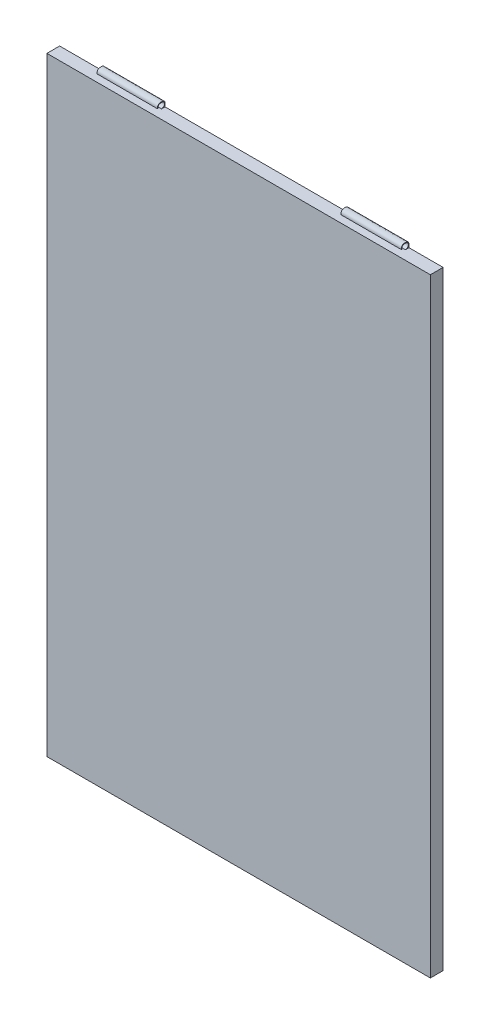
ISO-10303-21;
HEADER;
FILE_DESCRIPTION(('STEP AP214'),'2;1');
FILE_NAME('part.step','',(''),(''),'','','');
FILE_SCHEMA(('AUTOMOTIVE_DESIGN { 1 0 10303 214 1 1 1 1 }'));
ENDSEC;
DATA;
#1=APPLICATION_CONTEXT('core data for automotive mechanical design processes');
#2=APPLICATION_PROTOCOL_DEFINITION('international standard','automotive_design',2000,#1);
#3=PRODUCT_CONTEXT('',#1,'mechanical');
#4=PRODUCT('Part','Part','',(#3));
#5=PRODUCT_RELATED_PRODUCT_CATEGORY('part','',(#4));
#6=PRODUCT_DEFINITION_FORMATION('','',#4);
#7=PRODUCT_DEFINITION_CONTEXT('part definition',#1,'design');
#8=PRODUCT_DEFINITION('design','',#6,#7);
#9=PRODUCT_DEFINITION_SHAPE('','',#8);
#10=(LENGTH_UNIT() NAMED_UNIT(*) SI_UNIT(.MILLI.,.METRE.));
#11=(NAMED_UNIT(*) PLANE_ANGLE_UNIT() SI_UNIT($,.RADIAN.));
#12=(NAMED_UNIT(*) SI_UNIT($,.STERADIAN.) SOLID_ANGLE_UNIT());
#13=UNCERTAINTY_MEASURE_WITH_UNIT(LENGTH_MEASURE(1.E-05),#10,'distance_accuracy_value','');
#14=(GEOMETRIC_REPRESENTATION_CONTEXT(3) GLOBAL_UNCERTAINTY_ASSIGNED_CONTEXT((#13)) GLOBAL_UNIT_ASSIGNED_CONTEXT((#10,
#11,#12)) REPRESENTATION_CONTEXT('',''));
#15=CARTESIAN_POINT('',(0.,0.,0.));
#16=DIRECTION('',(0.,0.,1.));
#17=DIRECTION('',(1.,0.,0.));
#18=AXIS2_PLACEMENT_3D('',#15,#16,#17);
#19=CARTESIAN_POINT('',(0.,0.,-20.));
#20=DIRECTION('',(0.,0.,-1.));
#21=DIRECTION('',(-1.,0.,0.));
#22=AXIS2_PLACEMENT_3D('',#19,#20,#21);
#23=PLANE('',#22);
#24=DIRECTION('',(-1.,0.,0.));
#25=VECTOR('',#24,1.);
#26=CARTESIAN_POINT('',(0.,68.869953124109,-20.));
#27=LINE('',#26,#25);
#28=CARTESIAN_POINT('',(33.1920008977773,68.869953124109,-20.));
#29=VERTEX_POINT('',#28);
#30=CARTESIAN_POINT('',(-32.3754625293435,68.869953124109,-20.));
#31=VERTEX_POINT('',#30);
#32=EDGE_CURVE('E187',#29,#31,#27,.T.);
#33=ORIENTED_EDGE('',*,*,#32,.F.);
#34=DIRECTION('',(0.,1.,0.));
#35=VECTOR('',#34,1.);
#36=CARTESIAN_POINT('',(33.1920008977773,0.,-20.));
#37=LINE('',#36,#35);
#38=CARTESIAN_POINT('',(33.1920008977773,-67.6037996503738,-20.));
#39=VERTEX_POINT('',#38);
#40=EDGE_CURVE('E228',#29,#39,#37,.F.);
#41=ORIENTED_EDGE('',*,*,#40,.T.);
#42=DIRECTION('',(1.,0.,0.));
#43=VECTOR('',#42,1.);
#44=CARTESIAN_POINT('',(0.,-67.6037996503738,-20.));
#45=LINE('',#44,#43);
#46=CARTESIAN_POINT('',(-32.3754625293435,-67.6037996503738,-20.));
#47=VERTEX_POINT('',#46);
#48=EDGE_CURVE('E230',#39,#47,#45,.F.);
#49=ORIENTED_EDGE('',*,*,#48,.T.);
#50=DIRECTION('',(0.,-1.,0.));
#51=VECTOR('',#50,1.);
#52=CARTESIAN_POINT('',(-32.3754625293435,0.,-20.));
#53=LINE('',#52,#51);
#54=EDGE_CURVE('E222',#47,#31,#53,.F.);
#55=ORIENTED_EDGE('',*,*,#54,.T.);
#56=EDGE_LOOP('',(#33,#41,#49,#55));
#57=FACE_BOUND('',#56,.T.);
#58=CARTESIAN_POINT('',(0.808483055983302,-49.2230353206954,-20.));
#59=DIRECTION('',(0.,0.,-1.));
#60=DIRECTION('',(-1.,0.,0.));
#61=AXIS2_PLACEMENT_3D('',#58,#59,#60);
#62=CIRCLE('',#61,10.7664793209999);
#63=CARTESIAN_POINT('',(11.292084393654,-51.6748061016429,-20.));
#64=VERTEX_POINT('',#63);
#65=CARTESIAN_POINT('',(-9.68166732101493,-51.6466322421083,-20.));
#66=VERTEX_POINT('',#65);
#67=EDGE_CURVE('E181',#64,#66,#62,.T.);
#68=ORIENTED_EDGE('',*,*,#67,.F.);
#69=CARTESIAN_POINT('',(9.40670058917287,-51.2338766181754,-20.));
#70=DIRECTION('',(0.,0.,-1.));
#71=DIRECTION('',(-1.,0.,0.));
#72=AXIS2_PLACEMENT_3D('',#69,#70,#71);
#73=CIRCLE('',#72,1.93625693015948);
#74=CARTESIAN_POINT('',(7.52131678469175,-50.7929471347079,-20.));
#75=VERTEX_POINT('',#74);
#76=EDGE_CURVE('E192',#75,#64,#73,.T.);
#77=ORIENTED_EDGE('',*,*,#76,.F.);
#78=CARTESIAN_POINT('',(0.808483055983302,-49.2230353206954,-20.));
#79=DIRECTION('',(0.,0.,1.));
#80=DIRECTION('',(-1.,0.,0.));
#81=AXIS2_PLACEMENT_3D('',#78,#79,#80);
#82=CIRCLE('',#81,6.89396546068094);
#83=CARTESIAN_POINT('',(-5.9085441374204,-50.7749069185207,-20.));
#84=VERTEX_POINT('',#83);
#85=EDGE_CURVE('E202',#84,#75,#82,.T.);
#86=ORIENTED_EDGE('',*,*,#85,.F.);
#87=CARTESIAN_POINT('',(-7.79510572921767,-51.2107695803145,-20.));
#88=DIRECTION('',(0.,0.,-1.));
#89=DIRECTION('',(-1.,0.,0.));
#90=AXIS2_PLACEMENT_3D('',#87,#88,#89);
#91=CIRCLE('',#90,1.93625693015948);
#92=EDGE_CURVE('E200',#66,#84,#91,.T.);
#93=ORIENTED_EDGE('',*,*,#92,.F.);
#94=EDGE_LOOP('',(#68,#77,#86,#93));
#95=FACE_BOUND('',#94,.T.);
#96=ADVANCED_FACE('F39',(#57,#95),#23,.T.);
#97=CARTESIAN_POINT('',(0.,0.,-10.));
#98=DIRECTION('',(0.,0.,1.));
#99=DIRECTION('',(1.,0.,0.));
#100=AXIS2_PLACEMENT_3D('',#97,#98,#99);
#101=PLANE('',#100);
#102=DIRECTION('',(0.,1.,0.));
#103=VECTOR('',#102,1.);
#104=CARTESIAN_POINT('',(49.9466509577612,0.,-10.));
#105=LINE('',#104,#103);
#106=CARTESIAN_POINT('',(49.9466509577612,96.3447273186553,-10.));
#107=VERTEX_POINT('',#106);
#108=CARTESIAN_POINT('',(49.9466509577612,97.2555130394121,-10.));
#109=VERTEX_POINT('',#108);
#110=EDGE_CURVE('E415',#107,#109,#105,.T.);
#111=ORIENTED_EDGE('',*,*,#110,.F.);
#112=DIRECTION('',(-1.,0.,0.));
#113=VECTOR('',#112,1.);
#114=CARTESIAN_POINT('',(0.,96.3447273186553,-10.));
#115=LINE('',#114,#113);
#116=CARTESIAN_POINT('',(30.9466509577612,96.3447273186553,-10.));
#117=VERTEX_POINT('',#116);
#118=EDGE_CURVE('E11',#107,#117,#115,.T.);
#119=ORIENTED_EDGE('',*,*,#118,.T.);
#120=DIRECTION('',(0.,1.,0.));
#121=VECTOR('',#120,1.);
#122=CARTESIAN_POINT('',(30.9466509577614,0.,-10.));
#123=LINE('',#122,#121);
#124=CARTESIAN_POINT('',(30.9466509577613,97.2555130394121,-10.));
#125=VERTEX_POINT('',#124);
#126=EDGE_CURVE('E409',#117,#125,#123,.T.);
#127=ORIENTED_EDGE('',*,*,#126,.T.);
#128=DIRECTION('',(1.,0.,0.));
#129=VECTOR('',#128,1.);
#130=CARTESIAN_POINT('',(-59.8502367238898,97.2555130394121,-10.));
#131=LINE('',#130,#129);
#132=EDGE_CURVE('E354',#125,#109,#131,.T.);
#133=ORIENTED_EDGE('',*,*,#132,.T.);
#134=EDGE_LOOP('',(#111,#119,#127,#133));
#135=FACE_BOUND('',#134,.T.);
#136=ADVANCED_FACE('F287',(#135),#101,.F.);
#137=CARTESIAN_POINT('',(-59.8502367238898,98.3447273186553,-10.));
#138=DIRECTION('',(-1.,0.,0.));
#139=DIRECTION('',(0.,-1.,0.));
#140=AXIS2_PLACEMENT_3D('',#137,#138,#139);
#141=PLANE('',#140);
#142=DIRECTION('',(0.,0.,1.));
#143=VECTOR('',#142,1.);
#144=CARTESIAN_POINT('',(-59.8502367238898,-95.0785738449201,-10.));
#145=LINE('',#144,#143);
#146=CARTESIAN_POINT('',(-59.8502367238898,-95.0785738449201,-10.));
#147=VERTEX_POINT('',#146);
#148=CARTESIAN_POINT('',(-59.8502367238898,-95.0785738449201,-6.));
#149=VERTEX_POINT('',#148);
#150=EDGE_CURVE('E430',#147,#149,#145,.T.);
#151=ORIENTED_EDGE('',*,*,#150,.T.);
#152=DIRECTION('',(0.,-1.,0.));
#153=VECTOR('',#152,1.);
#154=CARTESIAN_POINT('',(-59.8502367238898,0.,-6.));
#155=LINE('',#154,#153);
#156=CARTESIAN_POINT('',(-59.8502367238899,96.3447273186553,-6.));
#157=VERTEX_POINT('',#156);
#158=EDGE_CURVE('E233',#157,#149,#155,.T.);
#159=ORIENTED_EDGE('',*,*,#158,.F.);
#160=DIRECTION('',(0.,0.,-1.));
#161=VECTOR('',#160,1.);
#162=CARTESIAN_POINT('',(-59.8502367238898,96.3447273186553,5.));
#163=LINE('',#162,#161);
#164=CARTESIAN_POINT('',(-59.8502367238898,96.3447273186553,-10.));
#165=VERTEX_POINT('',#164);
#166=EDGE_CURVE('E346',#157,#165,#163,.T.);
#167=ORIENTED_EDGE('',*,*,#166,.T.);
#168=DIRECTION('',(0.,-1.,0.));
#169=VECTOR('',#168,1.);
#170=CARTESIAN_POINT('',(-59.8502367238898,98.3447273186553,-10.));
#171=LINE('',#170,#169);
#172=EDGE_CURVE('E421',#165,#147,#171,.T.);
#173=ORIENTED_EDGE('',*,*,#172,.T.);
#174=EDGE_LOOP('',(#151,#159,#167,#173));
#175=FACE_BOUND('',#174,.T.);
#176=ADVANCED_FACE('F41',(#175),#141,.T.);
#177=CARTESIAN_POINT('',(60.6667750923236,98.3447273186553,-10.));
#178=DIRECTION('',(1.,0.,0.));
#179=DIRECTION('',(0.,1.,0.));
#180=AXIS2_PLACEMENT_3D('',#177,#178,#179);
#181=PLANE('',#180);
#182=DIRECTION('',(0.,0.,-1.));
#183=VECTOR('',#182,1.);
#184=CARTESIAN_POINT('',(60.6667750923236,96.3447273186553,5.));
#185=LINE('',#184,#183);
#186=CARTESIAN_POINT('',(60.6667750923236,96.3447273186553,-6.));
#187=VERTEX_POINT('',#186);
#188=CARTESIAN_POINT('',(60.6667750923236,96.3447273186553,-10.));
#189=VERTEX_POINT('',#188);
#190=EDGE_CURVE('E381',#187,#189,#185,.T.);
#191=ORIENTED_EDGE('',*,*,#190,.F.);
#192=DIRECTION('',(0.,-1.,0.));
#193=VECTOR('',#192,1.);
#194=CARTESIAN_POINT('',(60.6667750923236,0.,-6.));
#195=LINE('',#194,#193);
#196=CARTESIAN_POINT('',(60.6667750923236,-95.0785738449201,-6.));
#197=VERTEX_POINT('',#196);
#198=EDGE_CURVE('E62',#187,#197,#195,.T.);
#199=ORIENTED_EDGE('',*,*,#198,.T.);
#200=DIRECTION('',(0.,0.,1.));
#201=VECTOR('',#200,1.);
#202=CARTESIAN_POINT('',(60.6667750923236,-95.0785738449201,-10.));
#203=LINE('',#202,#201);
#204=CARTESIAN_POINT('',(60.6667750923236,-95.0785738449201,-10.));
#205=VERTEX_POINT('',#204);
#206=EDGE_CURVE('E431',#205,#197,#203,.T.);
#207=ORIENTED_EDGE('',*,*,#206,.F.);
#208=DIRECTION('',(0.,1.,0.));
#209=VECTOR('',#208,1.);
#210=CARTESIAN_POINT('',(60.6667750923236,98.3447273186553,-10.));
#211=LINE('',#210,#209);
#212=EDGE_CURVE('E427',#205,#189,#211,.T.);
#213=ORIENTED_EDGE('',*,*,#212,.T.);
#214=EDGE_LOOP('',(#191,#199,#207,#213));
#215=FACE_BOUND('',#214,.T.);
#216=ADVANCED_FACE('F288',(#215),#181,.T.);
#217=CARTESIAN_POINT('',(-59.8502367238898,-95.0785738449201,-10.));
#218=DIRECTION('',(0.,-1.,0.));
#219=DIRECTION('',(1.,0.,0.));
#220=AXIS2_PLACEMENT_3D('',#217,#218,#219);
#221=PLANE('',#220);
#222=ORIENTED_EDGE('',*,*,#206,.T.);
#223=DIRECTION('',(1.,0.,0.));
#224=VECTOR('',#223,1.);
#225=CARTESIAN_POINT('',(-59.8502367238898,-95.0785738449201,-6.));
#226=LINE('',#225,#224);
#227=EDGE_CURVE('E237',#149,#197,#226,.T.);
#228=ORIENTED_EDGE('',*,*,#227,.F.);
#229=ORIENTED_EDGE('',*,*,#150,.F.);
#230=DIRECTION('',(1.,0.,0.));
#231=VECTOR('',#230,1.);
#232=CARTESIAN_POINT('',(-59.8502367238898,-95.0785738449201,-10.));
#233=LINE('',#232,#231);
#234=EDGE_CURVE('E424',#147,#205,#233,.T.);
#235=ORIENTED_EDGE('',*,*,#234,.T.);
#236=EDGE_LOOP('',(#222,#228,#229,#235));
#237=FACE_BOUND('',#236,.T.);
#238=ADVANCED_FACE('F272',(#237),#221,.T.);
#239=CARTESIAN_POINT('',(0.,96.3447273186553,5.));
#240=DIRECTION('',(0.,1.,0.));
#241=DIRECTION('',(0.,0.,1.));
#242=AXIS2_PLACEMENT_3D('',#239,#240,#241);
#243=PLANE('',#242);
#244=ORIENTED_EDGE('',*,*,#166,.F.);
#245=DIRECTION('',(1.,0.,0.));
#246=VECTOR('',#245,1.);
#247=CARTESIAN_POINT('',(-59.8502367238899,96.3447273186553,-6.));
#248=LINE('',#247,#246);
#249=EDGE_CURVE('E235',#157,#187,#248,.T.);
#250=ORIENTED_EDGE('',*,*,#249,.T.);
#251=ORIENTED_EDGE('',*,*,#190,.T.);
#252=DIRECTION('',(-1.,0.,0.));
#253=VECTOR('',#252,1.);
#254=CARTESIAN_POINT('',(0.,96.3447273186553,-10.));
#255=LINE('',#254,#253);
#256=EDGE_CURVE('E418',#189,#107,#255,.T.);
#257=ORIENTED_EDGE('',*,*,#256,.T.);
#258=DIRECTION('',(0.,0.,-1.));
#259=VECTOR('',#258,1.);
#260=CARTESIAN_POINT('',(49.9466509577612,96.3447273186553,5.));
#261=LINE('',#260,#259);
#262=CARTESIAN_POINT('',(49.9466509577612,96.3447273186553,-8.88003181315877));
#263=VERTEX_POINT('',#262);
#264=EDGE_CURVE('E388',#263,#107,#261,.T.);
#265=ORIENTED_EDGE('',*,*,#264,.F.);
#266=DIRECTION('',(1.,0.,0.));
#267=VECTOR('',#266,1.);
#268=CARTESIAN_POINT('',(-59.8502367238898,96.3447273186553,-8.88003181315877));
#269=LINE('',#268,#267);
#270=CARTESIAN_POINT('',(30.9466509577613,96.3447273186553,-8.88003181315877));
#271=VERTEX_POINT('',#270);
#272=EDGE_CURVE('E461',#271,#263,#269,.T.);
#273=ORIENTED_EDGE('',*,*,#272,.F.);
#274=DIRECTION('',(0.,0.,-1.));
#275=VECTOR('',#274,1.);
#276=CARTESIAN_POINT('',(30.9466509577612,96.3447273186553,5.));
#277=LINE('',#276,#275);
#278=EDGE_CURVE('E391',#271,#117,#277,.T.);
#279=ORIENTED_EDGE('',*,*,#278,.T.);
#280=DIRECTION('',(-1.,0.,0.));
#281=VECTOR('',#280,1.);
#282=CARTESIAN_POINT('',(0.,96.3447273186553,-10.));
#283=LINE('',#282,#281);
#284=CARTESIAN_POINT('',(-26.7049820202208,96.3447273186553,-10.));
#285=VERTEX_POINT('',#284);
#286=EDGE_CURVE('E412',#117,#285,#283,.T.);
#287=ORIENTED_EDGE('',*,*,#286,.T.);
#288=DIRECTION('',(0.,0.,-1.));
#289=VECTOR('',#288,1.);
#290=CARTESIAN_POINT('',(-26.7049820202208,96.3447273186553,5.));
#291=LINE('',#290,#289);
#292=CARTESIAN_POINT('',(-26.7049820202208,96.3447273186553,-8.88003181315877));
#293=VERTEX_POINT('',#292);
#294=EDGE_CURVE('E394',#293,#285,#291,.T.);
#295=ORIENTED_EDGE('',*,*,#294,.F.);
#296=CARTESIAN_POINT('',(-45.7049820202211,96.3447273186553,-8.88003181315877));
#297=VERTEX_POINT('',#296);
#298=EDGE_CURVE('E463',#297,#293,#269,.T.);
#299=ORIENTED_EDGE('',*,*,#298,.F.);
#300=DIRECTION('',(0.,0.,-1.));
#301=VECTOR('',#300,1.);
#302=CARTESIAN_POINT('',(-45.7049820202211,96.3447273186553,5.));
#303=LINE('',#302,#301);
#304=CARTESIAN_POINT('',(-45.7049820202211,96.3447273186553,-10.));
#305=VERTEX_POINT('',#304);
#306=EDGE_CURVE('E397',#297,#305,#303,.T.);
#307=ORIENTED_EDGE('',*,*,#306,.T.);
#308=DIRECTION('',(-1.,0.,0.));
#309=VECTOR('',#308,1.);
#310=CARTESIAN_POINT('',(0.,96.3447273186553,-10.));
#311=LINE('',#310,#309);
#312=EDGE_CURVE('E403',#305,#165,#311,.T.);
#313=ORIENTED_EDGE('',*,*,#312,.T.);
#314=EDGE_LOOP('',(#244,#250,#251,#257,#265,#273,#279,#287,#295,#299,#307,#313));
#315=FACE_BOUND('',#314,.T.);
#316=ADVANCED_FACE('F268',(#315),#243,.T.);
#317=CARTESIAN_POINT('',(-45.7049820202211,0.,5.));
#318=DIRECTION('',(1.,0.,0.));
#319=DIRECTION('',(0.,0.,-1.));
#320=AXIS2_PLACEMENT_3D('',#317,#318,#319);
#321=PLANE('',#320);
#322=CARTESIAN_POINT('',(-45.7049820202211,93.6045387806541,-8.02086268222377));
#323=CARTESIAN_POINT('',(-45.7049820202211,95.5115383013814,-7.01920875815956));
#324=CARTESIAN_POINT('',(-45.7049820202211,96.3669366847805,-7.70299598643474));
#325=CARTESIAN_POINT('',(-45.7049820202211,95.7320906450999,-8.46988435886314));
#326=CARTESIAN_POINT('',(-45.7049820202211,96.7429601410779,-8.70366585531019));
#327=CARTESIAN_POINT('',(-45.7049820202211,95.4569973695629,-10.3902939392575));
#328=CARTESIAN_POINT('',(-45.7049820202211,96.6679447596651,-11.2232819651445));
#329=CARTESIAN_POINT('',(-45.7049820202211,97.1387516145502,-9.30210124980364));
#330=CARTESIAN_POINT('',(-45.7049820202211,97.6904883503185,-10.1101682424641));
#331=CARTESIAN_POINT('',(-45.7049820202211,97.7836186258863,-10.0381832196316));
#332=CARTESIAN_POINT('',(-45.7049820202211,97.9969673475245,-10.0719753124129));
#333=CARTESIAN_POINT('',(-45.7049820202211,98.1492572385907,-9.90246597727324));
#334=CARTESIAN_POINT('',(-45.7049820202211,98.4122459666342,-9.46811014375065));
#335=CARTESIAN_POINT('',(-45.7049820202211,98.7576467502433,-9.44119808195307));
#336=CARTESIAN_POINT('',(-45.7049820202211,97.8454701147923,-8.54582250529034));
#337=CARTESIAN_POINT('',(-45.7049820202211,98.575406385992,-8.6545382459571));
#338=CARTESIAN_POINT('',(-45.7049820202211,98.4676964877683,-7.99168226718814));
#339=CARTESIAN_POINT('',(-45.7049820202211,98.0451028655236,-7.51850789730775));
#340=CARTESIAN_POINT('',(-45.7049820202211,97.030214997743,-7.5993887706902));
#341=B_SPLINE_CURVE_WITH_KNOTS('',18,(#322,#323,#324,#325,#326,#327,#328,#329,#330,#331,#332,
#333,#334,#335,#336,#337,#338,#339,#340),.UNSPECIFIED.,.F.,.F.,(19,19),(0.,1.),.UNSPECIFIED.);
#342=CARTESIAN_POINT('',(-45.7049820202211,97.2555130394121,-10.));
#343=VERTEX_POINT('',#342);
#344=CARTESIAN_POINT('',(-45.7049820202211,97.030214997743,-7.5993887706902));
#345=VERTEX_POINT('',#344);
#346=EDGE_CURVE('E337',#343,#345,#341,.T.);
#347=ORIENTED_EDGE('',*,*,#346,.F.);
#348=DIRECTION('',(0.,1.,0.));
#349=VECTOR('',#348,1.);
#350=CARTESIAN_POINT('',(-45.7049820202211,0.,-10.));
#351=LINE('',#350,#349);
#352=EDGE_CURVE('E387',#305,#343,#351,.T.);
#353=ORIENTED_EDGE('',*,*,#352,.F.);
#354=ORIENTED_EDGE('',*,*,#306,.F.);
#355=CARTESIAN_POINT('',(-45.7049820202211,93.5115371252089,-7.84380141575238));
#356=CARTESIAN_POINT('',(-45.7049820202211,93.6796365005473,-7.75550700502478));
#357=CARTESIAN_POINT('',(-45.7049820202211,94.0521848228301,-7.58884216785646));
#358=CARTESIAN_POINT('',(-45.7049820202211,94.483512108504,-7.46525533591198));
#359=CARTESIAN_POINT('',(-45.7049820202211,94.8592682071652,-7.41338021825913));
#360=CARTESIAN_POINT('',(-45.7049820202211,95.2774284493317,-7.43132799578156));
#361=CARTESIAN_POINT('',(-45.7049820202211,95.6788787664288,-7.59016205835062));
#362=CARTESIAN_POINT('',(-45.7049820202211,96.0751000427127,-8.02417444821027));
#363=CARTESIAN_POINT('',(-45.7049820202211,96.2738744575302,-8.65340840823202));
#364=CARTESIAN_POINT('',(-45.7049820202211,96.4729392301511,-9.29799273226943));
#365=CARTESIAN_POINT('',(-45.7049820202211,96.7212661537214,-9.65511797016523));
#366=CARTESIAN_POINT('',(-45.7049820202211,97.0918124993319,-9.83420786110788));
#367=CARTESIAN_POINT('',(-45.7049820202211,97.682742311422,-9.77230484141328));
#368=CARTESIAN_POINT('',(-45.7049820202211,97.9526679332386,-9.59184600408019));
#369=CARTESIAN_POINT('',(-45.7049820202211,98.0855554256261,-9.29973963532084));
#370=CARTESIAN_POINT('',(-45.7049820202211,98.13209035026,-8.97938230132021));
#371=CARTESIAN_POINT('',(-45.7049820202211,98.1220468656768,-8.59580955201549));
#372=CARTESIAN_POINT('',(-45.7049820202211,98.0575816794197,-8.2806832690871));
#373=CARTESIAN_POINT('',(-45.7049820202211,97.9309495152617,-8.06833547533326));
#374=CARTESIAN_POINT('',(-45.7049820202211,97.7723468814387,-7.92426782304241));
#375=CARTESIAN_POINT('',(-45.7049820202211,97.5437555599903,-7.82803507365295));
#376=CARTESIAN_POINT('',(-45.7049820202211,97.2926940131087,-7.79057810242679));
#377=CARTESIAN_POINT('',(-45.7049820202211,97.1245031775957,-7.79250864574318));
#378=CARTESIAN_POINT('',(-45.7049820202211,97.0461035008579,-7.79875666045374));
#379=B_SPLINE_CURVE_WITH_KNOTS('',3,(#355,#356,#357,#358,#359,#360,#361,#362,#363,#364,#365,
#366,#367,#368,#369,#370,#371,#372,#373,#374,#375,#376,#377,#378),.UNSPECIFIED.,.F.,.F.,(4,1,1,
1,1,1,1,1,1,1,1,1,1,1,1,1,1,1,1,1,1,4),(0.,0.015625,0.03125,0.046875,0.0625,0.09375,0.125,
0.1875,0.25,0.3125,0.375,0.5,0.625,0.6875,0.75,0.8125,0.875,0.90625,0.9375,0.96875,0.984375,1.),.UNSPECIFIED.);
#380=CARTESIAN_POINT('',(-45.7049820202211,97.0461035008579,-7.79875666045374));
#381=VERTEX_POINT('',#380);
#382=EDGE_CURVE('E359',#297,#381,#379,.T.);
#383=ORIENTED_EDGE('',*,*,#382,.T.);
#384=DIRECTION('',(0.,-0.0794425155744432,0.996839448817714));
#385=VECTOR('',#384,1.);
#386=CARTESIAN_POINT('',(-45.7049820202211,95.4200826620397,12.6044456426603));
#387=LINE('',#386,#385);
#388=EDGE_CURVE('E350',#381,#345,#387,.T.);
#389=ORIENTED_EDGE('',*,*,#388,.T.);
#390=EDGE_LOOP('',(#347,#353,#354,#383,#389));
#391=FACE_BOUND('',#390,.T.);
#392=ADVANCED_FACE('F271',(#391),#321,.F.);
#393=CARTESIAN_POINT('',(30.9466509577614,0.,5.));
#394=DIRECTION('',(1.,0.,0.));
#395=DIRECTION('',(0.,1.,0.));
#396=AXIS2_PLACEMENT_3D('',#393,#394,#395);
#397=PLANE('',#396);
#398=CARTESIAN_POINT('',(30.9466509577613,93.6045387806541,-8.02086268222377));
#399=CARTESIAN_POINT('',(30.9466509577613,95.5115383013814,-7.01920875815956));
#400=CARTESIAN_POINT('',(30.9466509577613,96.3669366847805,-7.70299598643474));
#401=CARTESIAN_POINT('',(30.9466509577613,95.7320906450999,-8.46988435886314));
#402=CARTESIAN_POINT('',(30.9466509577613,96.7429601410779,-8.70366585531019));
#403=CARTESIAN_POINT('',(30.9466509577613,95.4569973695629,-10.3902939392575));
#404=CARTESIAN_POINT('',(30.9466509577613,96.6679447596651,-11.2232819651445));
#405=CARTESIAN_POINT('',(30.9466509577613,97.1387516145502,-9.30210124980364));
#406=CARTESIAN_POINT('',(30.9466509577613,97.6904883503185,-10.1101682424641));
#407=CARTESIAN_POINT('',(30.9466509577613,97.7836186258863,-10.0381832196316));
#408=CARTESIAN_POINT('',(30.9466509577613,97.9969673475245,-10.0719753124129));
#409=CARTESIAN_POINT('',(30.9466509577613,98.1492572385907,-9.90246597727324));
#410=CARTESIAN_POINT('',(30.9466509577613,98.4122459666342,-9.46811014375065));
#411=CARTESIAN_POINT('',(30.9466509577613,98.7576467502433,-9.44119808195307));
#412=CARTESIAN_POINT('',(30.9466509577613,97.8454701147923,-8.54582250529034));
#413=CARTESIAN_POINT('',(30.9466509577613,98.575406385992,-8.6545382459571));
#414=CARTESIAN_POINT('',(30.9466509577613,98.4676964877683,-7.99168226718814));
#415=CARTESIAN_POINT('',(30.9466509577613,98.0451028655236,-7.51850789730775));
#416=CARTESIAN_POINT('',(30.9466509577613,97.030214997743,-7.5993887706902));
#417=B_SPLINE_CURVE_WITH_KNOTS('',18,(#398,#399,#400,#401,#402,#403,#404,#405,#406,#407,#408,
#409,#410,#411,#412,#413,#414,#415,#416),.UNSPECIFIED.,.F.,.F.,(19,19),(0.,1.),.UNSPECIFIED.);
#418=CARTESIAN_POINT('',(30.9466509577612,97.030214997743,-7.5993887706902));
#419=VERTEX_POINT('',#418);
#420=EDGE_CURVE('E347',#125,#419,#417,.T.);
#421=ORIENTED_EDGE('',*,*,#420,.F.);
#422=ORIENTED_EDGE('',*,*,#126,.F.);
#423=ORIENTED_EDGE('',*,*,#278,.F.);
#424=CARTESIAN_POINT('',(30.9466509577613,93.5115371252089,-7.84380141575238));
#425=CARTESIAN_POINT('',(30.9466509577613,93.6796365005473,-7.75550700502478));
#426=CARTESIAN_POINT('',(30.9466509577613,94.0521848228301,-7.58884216785646));
#427=CARTESIAN_POINT('',(30.9466509577613,94.483512108504,-7.46525533591198));
#428=CARTESIAN_POINT('',(30.9466509577613,94.8592682071652,-7.41338021825913));
#429=CARTESIAN_POINT('',(30.9466509577613,95.2774284493317,-7.43132799578156));
#430=CARTESIAN_POINT('',(30.9466509577613,95.6788787664288,-7.59016205835062));
#431=CARTESIAN_POINT('',(30.9466509577613,96.0751000427127,-8.02417444821027));
#432=CARTESIAN_POINT('',(30.9466509577613,96.2738744575302,-8.65340840823202));
#433=CARTESIAN_POINT('',(30.9466509577613,96.4729392301511,-9.29799273226943));
#434=CARTESIAN_POINT('',(30.9466509577613,96.7212661537214,-9.65511797016523));
#435=CARTESIAN_POINT('',(30.9466509577613,97.0918124993319,-9.83420786110788));
#436=CARTESIAN_POINT('',(30.9466509577613,97.682742311422,-9.77230484141328));
#437=CARTESIAN_POINT('',(30.9466509577613,97.9526679332386,-9.59184600408019));
#438=CARTESIAN_POINT('',(30.9466509577613,98.0855554256261,-9.29973963532084));
#439=CARTESIAN_POINT('',(30.9466509577613,98.13209035026,-8.97938230132021));
#440=CARTESIAN_POINT('',(30.9466509577613,98.1220468656768,-8.59580955201549));
#441=CARTESIAN_POINT('',(30.9466509577613,98.0575816794197,-8.2806832690871));
#442=CARTESIAN_POINT('',(30.9466509577613,97.9309495152617,-8.06833547533326));
#443=CARTESIAN_POINT('',(30.9466509577613,97.7723468814387,-7.92426782304241));
#444=CARTESIAN_POINT('',(30.9466509577613,97.5437555599903,-7.82803507365295));
#445=CARTESIAN_POINT('',(30.9466509577613,97.2926940131087,-7.79057810242679));
#446=CARTESIAN_POINT('',(30.9466509577613,97.1245031775957,-7.79250864574318));
#447=CARTESIAN_POINT('',(30.9466509577613,97.0461035008579,-7.79875666045374));
#448=B_SPLINE_CURVE_WITH_KNOTS('',3,(#424,#425,#426,#427,#428,#429,#430,#431,#432,#433,#434,
#435,#436,#437,#438,#439,#440,#441,#442,#443,#444,#445,#446,#447),.UNSPECIFIED.,.F.,.F.,(4,1,1,
1,1,1,1,1,1,1,1,1,1,1,1,1,1,1,1,1,1,4),(0.,0.015625,0.03125,0.046875,0.0625,0.09375,0.125,
0.1875,0.25,0.3125,0.375,0.5,0.625,0.6875,0.75,0.8125,0.875,0.90625,0.9375,0.96875,0.984375,1.),.UNSPECIFIED.);
#449=CARTESIAN_POINT('',(30.9466509577613,97.0461035008579,-7.79875666045374));
#450=VERTEX_POINT('',#449);
#451=EDGE_CURVE('E467',#271,#450,#448,.T.);
#452=ORIENTED_EDGE('',*,*,#451,.T.);
#453=DIRECTION('',(0.,-0.0794425155744432,0.996839448817714));
#454=VECTOR('',#453,1.);
#455=CARTESIAN_POINT('',(30.9466509577612,95.4200826620397,12.6044456426603));
#456=LINE('',#455,#454);
#457=EDGE_CURVE('E361',#450,#419,#456,.T.);
#458=ORIENTED_EDGE('',*,*,#457,.T.);
#459=EDGE_LOOP('',(#421,#422,#423,#452,#458));
#460=FACE_BOUND('',#459,.T.);
#461=ADVANCED_FACE('F274',(#460),#397,.F.);
#462=CARTESIAN_POINT('',(-26.704982020221,0.,5.));
#463=DIRECTION('',(1.,0.,0.));
#464=DIRECTION('',(0.,1.,0.));
#465=AXIS2_PLACEMENT_3D('',#462,#463,#464);
#466=PLANE('',#465);
#467=DIRECTION('',(0.,1.,0.));
#468=VECTOR('',#467,1.);
#469=CARTESIAN_POINT('',(-26.704982020221,0.,-10.));
#470=LINE('',#469,#468);
#471=CARTESIAN_POINT('',(-26.704982020221,97.2555130394121,-10.));
#472=VERTEX_POINT('',#471);
#473=EDGE_CURVE('E406',#285,#472,#470,.T.);
#474=ORIENTED_EDGE('',*,*,#473,.T.);
#475=CARTESIAN_POINT('',(-26.704982020221,93.6045387806541,-8.02086268222377));
#476=CARTESIAN_POINT('',(-26.704982020221,95.5115383013814,-7.01920875815956));
#477=CARTESIAN_POINT('',(-26.704982020221,96.3669366847805,-7.70299598643474));
#478=CARTESIAN_POINT('',(-26.704982020221,95.7320906450999,-8.46988435886314));
#479=CARTESIAN_POINT('',(-26.704982020221,96.7429601410779,-8.70366585531019));
#480=CARTESIAN_POINT('',(-26.704982020221,95.4569973695629,-10.3902939392575));
#481=CARTESIAN_POINT('',(-26.704982020221,96.6679447596651,-11.2232819651445));
#482=CARTESIAN_POINT('',(-26.704982020221,97.1387516145502,-9.30210124980364));
#483=CARTESIAN_POINT('',(-26.704982020221,97.6904883503185,-10.1101682424641));
#484=CARTESIAN_POINT('',(-26.704982020221,97.7836186258863,-10.0381832196316));
#485=CARTESIAN_POINT('',(-26.704982020221,97.9969673475245,-10.0719753124129));
#486=CARTESIAN_POINT('',(-26.704982020221,98.1492572385907,-9.90246597727324));
#487=CARTESIAN_POINT('',(-26.704982020221,98.4122459666342,-9.46811014375065));
#488=CARTESIAN_POINT('',(-26.704982020221,98.7576467502433,-9.44119808195307));
#489=CARTESIAN_POINT('',(-26.704982020221,97.8454701147923,-8.54582250529034));
#490=CARTESIAN_POINT('',(-26.704982020221,98.575406385992,-8.6545382459571));
#491=CARTESIAN_POINT('',(-26.704982020221,98.4676964877683,-7.99168226718814));
#492=CARTESIAN_POINT('',(-26.704982020221,98.0451028655236,-7.51850789730775));
#493=CARTESIAN_POINT('',(-26.704982020221,97.030214997743,-7.5993887706902));
#494=B_SPLINE_CURVE_WITH_KNOTS('',18,(#475,#476,#477,#478,#479,#480,#481,#482,#483,#484,#485,
#486,#487,#488,#489,#490,#491,#492,#493),.UNSPECIFIED.,.F.,.F.,(19,19),(0.,1.),.UNSPECIFIED.);
#495=CARTESIAN_POINT('',(-26.7049820202208,97.030214997743,-7.5993887706902));
#496=VERTEX_POINT('',#495);
#497=EDGE_CURVE('E360',#472,#496,#494,.T.);
#498=ORIENTED_EDGE('',*,*,#497,.T.);
#499=DIRECTION('',(0.,-0.0794425155744432,0.996839448817714));
#500=VECTOR('',#499,1.);
#501=CARTESIAN_POINT('',(-26.7049820202208,95.4200826620397,12.6044456426603));
#502=LINE('',#501,#500);
#503=CARTESIAN_POINT('',(-26.704982020221,97.0461035008579,-7.79875666045374));
#504=VERTEX_POINT('',#503);
#505=EDGE_CURVE('E353',#504,#496,#502,.T.);
#506=ORIENTED_EDGE('',*,*,#505,.F.);
#507=CARTESIAN_POINT('',(-26.704982020221,93.5115371252089,-7.84380141575238));
#508=CARTESIAN_POINT('',(-26.704982020221,93.6796365005473,-7.75550700502478));
#509=CARTESIAN_POINT('',(-26.704982020221,94.0521848228301,-7.58884216785646));
#510=CARTESIAN_POINT('',(-26.704982020221,94.483512108504,-7.46525533591198));
#511=CARTESIAN_POINT('',(-26.704982020221,94.8592682071652,-7.41338021825913));
#512=CARTESIAN_POINT('',(-26.704982020221,95.2774284493317,-7.43132799578156));
#513=CARTESIAN_POINT('',(-26.704982020221,95.6788787664288,-7.59016205835062));
#514=CARTESIAN_POINT('',(-26.704982020221,96.0751000427127,-8.02417444821027));
#515=CARTESIAN_POINT('',(-26.704982020221,96.2738744575302,-8.65340840823202));
#516=CARTESIAN_POINT('',(-26.704982020221,96.4729392301511,-9.29799273226943));
#517=CARTESIAN_POINT('',(-26.704982020221,96.7212661537214,-9.65511797016523));
#518=CARTESIAN_POINT('',(-26.704982020221,97.0918124993319,-9.83420786110788));
#519=CARTESIAN_POINT('',(-26.704982020221,97.682742311422,-9.77230484141328));
#520=CARTESIAN_POINT('',(-26.704982020221,97.9526679332386,-9.59184600408019));
#521=CARTESIAN_POINT('',(-26.704982020221,98.0855554256261,-9.29973963532084));
#522=CARTESIAN_POINT('',(-26.704982020221,98.13209035026,-8.97938230132021));
#523=CARTESIAN_POINT('',(-26.704982020221,98.1220468656768,-8.59580955201549));
#524=CARTESIAN_POINT('',(-26.704982020221,98.0575816794197,-8.2806832690871));
#525=CARTESIAN_POINT('',(-26.704982020221,97.9309495152617,-8.06833547533326));
#526=CARTESIAN_POINT('',(-26.704982020221,97.7723468814387,-7.92426782304241));
#527=CARTESIAN_POINT('',(-26.704982020221,97.5437555599903,-7.82803507365295));
#528=CARTESIAN_POINT('',(-26.704982020221,97.2926940131087,-7.79057810242679));
#529=CARTESIAN_POINT('',(-26.704982020221,97.1245031775957,-7.79250864574318));
#530=CARTESIAN_POINT('',(-26.704982020221,97.0461035008579,-7.79875666045374));
#531=B_SPLINE_CURVE_WITH_KNOTS('',3,(#507,#508,#509,#510,#511,#512,#513,#514,#515,#516,#517,
#518,#519,#520,#521,#522,#523,#524,#525,#526,#527,#528,#529,#530),.UNSPECIFIED.,.F.,.F.,(4,1,1,
1,1,1,1,1,1,1,1,1,1,1,1,1,1,1,1,1,1,4),(0.,0.015625,0.03125,0.046875,0.0625,0.09375,0.125,
0.1875,0.25,0.3125,0.375,0.5,0.625,0.6875,0.75,0.8125,0.875,0.90625,0.9375,0.96875,0.984375,1.),.UNSPECIFIED.);
#532=EDGE_CURVE('E451',#293,#504,#531,.T.);
#533=ORIENTED_EDGE('',*,*,#532,.F.);
#534=ORIENTED_EDGE('',*,*,#294,.T.);
#535=EDGE_LOOP('',(#474,#498,#506,#533,#534));
#536=FACE_BOUND('',#535,.T.);
#537=ADVANCED_FACE('F266',(#536),#466,.T.);
#538=CARTESIAN_POINT('',(49.9466509577612,0.,5.));
#539=DIRECTION('',(1.,0.,0.));
#540=DIRECTION('',(0.,0.,-1.));
#541=AXIS2_PLACEMENT_3D('',#538,#539,#540);
#542=PLANE('',#541);
#543=ORIENTED_EDGE('',*,*,#110,.T.);
#544=CARTESIAN_POINT('',(49.9466509577612,93.6045387806541,-8.02086268222377));
#545=CARTESIAN_POINT('',(49.9466509577612,95.5115383013814,-7.01920875815956));
#546=CARTESIAN_POINT('',(49.9466509577612,96.3669366847805,-7.70299598643474));
#547=CARTESIAN_POINT('',(49.9466509577612,95.7320906450999,-8.46988435886314));
#548=CARTESIAN_POINT('',(49.9466509577612,96.7429601410779,-8.70366585531019));
#549=CARTESIAN_POINT('',(49.9466509577612,95.4569973695629,-10.3902939392575));
#550=CARTESIAN_POINT('',(49.9466509577612,96.6679447596651,-11.2232819651445));
#551=CARTESIAN_POINT('',(49.9466509577612,97.1387516145502,-9.30210124980364));
#552=CARTESIAN_POINT('',(49.9466509577612,97.6904883503185,-10.1101682424641));
#553=CARTESIAN_POINT('',(49.9466509577612,97.7836186258863,-10.0381832196316));
#554=CARTESIAN_POINT('',(49.9466509577612,97.9969673475245,-10.0719753124129));
#555=CARTESIAN_POINT('',(49.9466509577612,98.1492572385907,-9.90246597727324));
#556=CARTESIAN_POINT('',(49.9466509577612,98.4122459666342,-9.46811014375065));
#557=CARTESIAN_POINT('',(49.9466509577612,98.7576467502433,-9.44119808195307));
#558=CARTESIAN_POINT('',(49.9466509577612,97.8454701147923,-8.54582250529034));
#559=CARTESIAN_POINT('',(49.9466509577612,98.575406385992,-8.6545382459571));
#560=CARTESIAN_POINT('',(49.9466509577612,98.4676964877683,-7.99168226718814));
#561=CARTESIAN_POINT('',(49.9466509577612,98.0451028655236,-7.51850789730775));
#562=CARTESIAN_POINT('',(49.9466509577612,97.030214997743,-7.5993887706902));
#563=B_SPLINE_CURVE_WITH_KNOTS('',18,(#544,#545,#546,#547,#548,#549,#550,#551,#552,#553,#554,
#555,#556,#557,#558,#559,#560,#561,#562),.UNSPECIFIED.,.F.,.F.,(19,19),(0.,1.),.UNSPECIFIED.);
#564=CARTESIAN_POINT('',(49.9466509577612,97.030214997743,-7.5993887706902));
#565=VERTEX_POINT('',#564);
#566=EDGE_CURVE('E458',#109,#565,#563,.T.);
#567=ORIENTED_EDGE('',*,*,#566,.T.);
#568=DIRECTION('',(0.,-0.0794425155744432,0.996839448817714));
#569=VECTOR('',#568,1.);
#570=CARTESIAN_POINT('',(49.9466509577612,95.8160398292293,7.63600120906426));
#571=LINE('',#570,#569);
#572=CARTESIAN_POINT('',(49.9466509577612,97.0461035008579,-7.79875666045374));
#573=VERTEX_POINT('',#572);
#574=EDGE_CURVE('E472',#573,#565,#571,.T.);
#575=ORIENTED_EDGE('',*,*,#574,.F.);
#576=CARTESIAN_POINT('',(49.9466509577612,93.5115371252089,-7.84380141575238));
#577=CARTESIAN_POINT('',(49.9466509577612,93.6796365005473,-7.75550700502478));
#578=CARTESIAN_POINT('',(49.9466509577612,94.0521848228301,-7.58884216785646));
#579=CARTESIAN_POINT('',(49.9466509577612,94.483512108504,-7.46525533591198));
#580=CARTESIAN_POINT('',(49.9466509577612,94.8592682071652,-7.41338021825913));
#581=CARTESIAN_POINT('',(49.9466509577612,95.2774284493317,-7.43132799578156));
#582=CARTESIAN_POINT('',(49.9466509577612,95.6788787664288,-7.59016205835062));
#583=CARTESIAN_POINT('',(49.9466509577612,96.0751000427127,-8.02417444821027));
#584=CARTESIAN_POINT('',(49.9466509577612,96.2738744575302,-8.65340840823202));
#585=CARTESIAN_POINT('',(49.9466509577612,96.4729392301511,-9.29799273226943));
#586=CARTESIAN_POINT('',(49.9466509577612,96.7212661537214,-9.65511797016523));
#587=CARTESIAN_POINT('',(49.9466509577612,97.0918124993319,-9.83420786110788));
#588=CARTESIAN_POINT('',(49.9466509577612,97.682742311422,-9.77230484141328));
#589=CARTESIAN_POINT('',(49.9466509577612,97.9526679332386,-9.59184600408019));
#590=CARTESIAN_POINT('',(49.9466509577612,98.0855554256261,-9.29973963532084));
#591=CARTESIAN_POINT('',(49.9466509577612,98.13209035026,-8.97938230132021));
#592=CARTESIAN_POINT('',(49.9466509577612,98.1220468656768,-8.59580955201549));
#593=CARTESIAN_POINT('',(49.9466509577612,98.0575816794197,-8.2806832690871));
#594=CARTESIAN_POINT('',(49.9466509577612,97.9309495152617,-8.06833547533326));
#595=CARTESIAN_POINT('',(49.9466509577612,97.7723468814387,-7.92426782304241));
#596=CARTESIAN_POINT('',(49.9466509577612,97.5437555599903,-7.82803507365295));
#597=CARTESIAN_POINT('',(49.9466509577612,97.2926940131087,-7.79057810242679));
#598=CARTESIAN_POINT('',(49.9466509577612,97.1245031775957,-7.79250864574318));
#599=CARTESIAN_POINT('',(49.9466509577612,97.0461035008579,-7.79875666045374));
#600=B_SPLINE_CURVE_WITH_KNOTS('',3,(#576,#577,#578,#579,#580,#581,#582,#583,#584,#585,#586,
#587,#588,#589,#590,#591,#592,#593,#594,#595,#596,#597,#598,#599),.UNSPECIFIED.,.F.,.F.,(4,1,1,
1,1,1,1,1,1,1,1,1,1,1,1,1,1,1,1,1,1,4),(0.,0.015625,0.03125,0.046875,0.0625,0.09375,0.125,
0.1875,0.25,0.3125,0.375,0.5,0.625,0.6875,0.75,0.8125,0.875,0.90625,0.9375,0.96875,0.984375,1.),.UNSPECIFIED.);
#601=EDGE_CURVE('E239',#263,#573,#600,.T.);
#602=ORIENTED_EDGE('',*,*,#601,.F.);
#603=ORIENTED_EDGE('',*,*,#264,.T.);
#604=EDGE_LOOP('',(#543,#567,#575,#602,#603));
#605=FACE_BOUND('',#604,.T.);
#606=ADVANCED_FACE('F262',(#605),#542,.T.);
#607=ORIENTED_EDGE('',*,*,#473,.F.);
#608=EDGE_CURVE('E43',#285,#305,#115,.T.);
#609=ORIENTED_EDGE('',*,*,#608,.T.);
#610=ORIENTED_EDGE('',*,*,#352,.T.);
#611=EDGE_CURVE('E342',#343,#472,#131,.T.);
#612=ORIENTED_EDGE('',*,*,#611,.T.);
#613=EDGE_LOOP('',(#607,#609,#610,#612));
#614=FACE_BOUND('',#613,.T.);
#615=ADVANCED_FACE('F265',(#614),#101,.F.);
#616=CARTESIAN_POINT('',(-59.8502367238898,93.5115371252089,-7.84380141575238));
#617=CARTESIAN_POINT('',(-59.8502367238898,93.6796365005473,-7.75550700502478));
#618=CARTESIAN_POINT('',(-59.8502367238898,94.0521848228301,-7.58884216785646));
#619=CARTESIAN_POINT('',(-59.8502367238898,94.483512108504,-7.46525533591198));
#620=CARTESIAN_POINT('',(-59.8502367238898,94.8592682071652,-7.41338021825913));
#621=CARTESIAN_POINT('',(-59.8502367238898,95.2774284493317,-7.43132799578156));
#622=CARTESIAN_POINT('',(-59.8502367238898,95.6788787664288,-7.59016205835062));
#623=CARTESIAN_POINT('',(-59.8502367238898,96.0751000427127,-8.02417444821027));
#624=CARTESIAN_POINT('',(-59.8502367238898,96.2738744575302,-8.65340840823202));
#625=CARTESIAN_POINT('',(-59.8502367238898,96.4729392301511,-9.29799273226943));
#626=CARTESIAN_POINT('',(-59.8502367238898,96.7212661537214,-9.65511797016523));
#627=CARTESIAN_POINT('',(-59.8502367238898,97.0918124993319,-9.83420786110788));
#628=CARTESIAN_POINT('',(-59.8502367238898,97.682742311422,-9.77230484141328));
#629=CARTESIAN_POINT('',(-59.8502367238898,97.9526679332386,-9.59184600408019));
#630=CARTESIAN_POINT('',(-59.8502367238898,98.0855554256261,-9.29973963532084));
#631=CARTESIAN_POINT('',(-59.8502367238898,98.13209035026,-8.97938230132021));
#632=CARTESIAN_POINT('',(-59.8502367238898,98.1220468656768,-8.59580955201549));
#633=CARTESIAN_POINT('',(-59.8502367238898,98.0575816794197,-8.2806832690871));
#634=CARTESIAN_POINT('',(-59.8502367238898,97.9309495152617,-8.06833547533326));
#635=CARTESIAN_POINT('',(-59.8502367238898,97.7723468814387,-7.92426782304241));
#636=CARTESIAN_POINT('',(-59.8502367238898,97.5437555599903,-7.82803507365295));
#637=CARTESIAN_POINT('',(-59.8502367238898,97.2926940131087,-7.79057810242679));
#638=CARTESIAN_POINT('',(-59.8502367238898,97.1245031775957,-7.79250864574318));
#639=CARTESIAN_POINT('',(-59.8502367238898,97.0461035008579,-7.79875666045374));
#640=B_SPLINE_CURVE_WITH_KNOTS('',3,(#616,#617,#618,#619,#620,#621,#622,#623,#624,#625,#626,
#627,#628,#629,#630,#631,#632,#633,#634,#635,#636,#637,#638,#639),.UNSPECIFIED.,.F.,.F.,(4,1,1,
1,1,1,1,1,1,1,1,1,1,1,1,1,1,1,1,1,1,4),(0.,0.015625,0.03125,0.046875,0.0625,0.09375,0.125,
0.1875,0.25,0.3125,0.375,0.5,0.625,0.6875,0.75,0.8125,0.875,0.90625,0.9375,0.96875,0.984375,1.),.UNSPECIFIED.);
#641=DIRECTION('',(1.,0.,0.));
#642=VECTOR('',#641,1.);
#643=SURFACE_OF_LINEAR_EXTRUSION('',#640,#642);
#644=ORIENTED_EDGE('',*,*,#272,.T.);
#645=ORIENTED_EDGE('',*,*,#601,.T.);
#646=DIRECTION('',(1.,0.,0.));
#647=VECTOR('',#646,1.);
#648=CARTESIAN_POINT('',(-59.8502367238898,97.0461035008579,-7.79875666045374));
#649=LINE('',#648,#647);
#650=EDGE_CURVE('E474',#450,#573,#649,.T.);
#651=ORIENTED_EDGE('',*,*,#650,.F.);
#652=ORIENTED_EDGE('',*,*,#451,.F.);
#653=EDGE_LOOP('',(#644,#645,#651,#652));
#654=FACE_BOUND('',#653,.T.);
#655=ADVANCED_FACE('F260',(#654),#643,.F.);
#656=CARTESIAN_POINT('',(-59.8502367238898,95.8160398292293,7.63600120906426));
#657=DIRECTION('',(0.,0.996839448817714,0.0794425155744432));
#658=DIRECTION('',(0.,-0.0794425155744432,0.996839448817714));
#659=AXIS2_PLACEMENT_3D('',#656,#657,#658);
#660=PLANE('',#659);
#661=ORIENTED_EDGE('',*,*,#650,.T.);
#662=ORIENTED_EDGE('',*,*,#574,.T.);
#663=DIRECTION('',(1.,0.,0.));
#664=VECTOR('',#663,1.);
#665=CARTESIAN_POINT('',(-59.8502367238898,97.030214997743,-7.5993887706902));
#666=LINE('',#665,#664);
#667=EDGE_CURVE('E355',#419,#565,#666,.T.);
#668=ORIENTED_EDGE('',*,*,#667,.F.);
#669=ORIENTED_EDGE('',*,*,#457,.F.);
#670=EDGE_LOOP('',(#661,#662,#668,#669));
#671=FACE_BOUND('',#670,.T.);
#672=ADVANCED_FACE('F333',(#671),#660,.F.);
#673=CARTESIAN_POINT('',(-59.8502367238898,93.6045387806541,-8.02086268222377));
#674=CARTESIAN_POINT('',(-59.8502367238898,95.5115383013814,-7.01920875815956));
#675=CARTESIAN_POINT('',(-59.8502367238898,96.3669366847805,-7.70299598643474));
#676=CARTESIAN_POINT('',(-59.8502367238898,95.7320906450999,-8.46988435886314));
#677=CARTESIAN_POINT('',(-59.8502367238898,96.7429601410779,-8.70366585531019));
#678=CARTESIAN_POINT('',(-59.8502367238898,95.4569973695629,-10.3902939392575));
#679=CARTESIAN_POINT('',(-59.8502367238898,96.6679447596651,-11.2232819651445));
#680=CARTESIAN_POINT('',(-59.8502367238898,97.1387516145502,-9.30210124980364));
#681=CARTESIAN_POINT('',(-59.8502367238898,97.6904883503185,-10.1101682424641));
#682=CARTESIAN_POINT('',(-59.8502367238898,97.7836186258863,-10.0381832196316));
#683=CARTESIAN_POINT('',(-59.8502367238898,97.9969673475245,-10.0719753124129));
#684=CARTESIAN_POINT('',(-59.8502367238898,98.1492572385907,-9.90246597727324));
#685=CARTESIAN_POINT('',(-59.8502367238898,98.4122459666342,-9.46811014375065));
#686=CARTESIAN_POINT('',(-59.8502367238898,98.7576467502433,-9.44119808195307));
#687=CARTESIAN_POINT('',(-59.8502367238898,97.8454701147923,-8.54582250529034));
#688=CARTESIAN_POINT('',(-59.8502367238898,98.575406385992,-8.6545382459571));
#689=CARTESIAN_POINT('',(-59.8502367238898,98.4676964877683,-7.99168226718814));
#690=CARTESIAN_POINT('',(-59.8502367238898,98.0451028655236,-7.51850789730775));
#691=CARTESIAN_POINT('',(-59.8502367238898,97.030214997743,-7.5993887706902));
#692=B_SPLINE_CURVE_WITH_KNOTS('',18,(#673,#674,#675,#676,#677,#678,#679,#680,#681,#682,#683,
#684,#685,#686,#687,#688,#689,#690,#691),.UNSPECIFIED.,.F.,.F.,(19,19),(0.,1.),.UNSPECIFIED.);
#693=DIRECTION('',(1.,0.,0.));
#694=VECTOR('',#693,1.);
#695=SURFACE_OF_LINEAR_EXTRUSION('',#692,#694);
#696=ORIENTED_EDGE('',*,*,#420,.T.);
#697=ORIENTED_EDGE('',*,*,#667,.T.);
#698=ORIENTED_EDGE('',*,*,#566,.F.);
#699=ORIENTED_EDGE('',*,*,#132,.F.);
#700=EDGE_LOOP('',(#696,#697,#698,#699));
#701=FACE_BOUND('',#700,.T.);
#702=ADVANCED_FACE('F326',(#701),#695,.T.);
#703=ORIENTED_EDGE('',*,*,#346,.T.);
#704=EDGE_CURVE('E339',#345,#496,#666,.T.);
#705=ORIENTED_EDGE('',*,*,#704,.T.);
#706=ORIENTED_EDGE('',*,*,#497,.F.);
#707=ORIENTED_EDGE('',*,*,#611,.F.);
#708=EDGE_LOOP('',(#703,#705,#706,#707));
#709=FACE_BOUND('',#708,.T.);
#710=ADVANCED_FACE('F324',(#709),#695,.T.);
#711=EDGE_CURVE('E473',#381,#504,#649,.T.);
#712=ORIENTED_EDGE('',*,*,#711,.T.);
#713=ORIENTED_EDGE('',*,*,#505,.T.);
#714=ORIENTED_EDGE('',*,*,#704,.F.);
#715=ORIENTED_EDGE('',*,*,#388,.F.);
#716=EDGE_LOOP('',(#712,#713,#714,#715));
#717=FACE_BOUND('',#716,.T.);
#718=ADVANCED_FACE('F258',(#717),#660,.F.);
#719=ORIENTED_EDGE('',*,*,#298,.T.);
#720=ORIENTED_EDGE('',*,*,#532,.T.);
#721=ORIENTED_EDGE('',*,*,#711,.F.);
#722=ORIENTED_EDGE('',*,*,#382,.F.);
#723=EDGE_LOOP('',(#719,#720,#721,#722));
#724=FACE_BOUND('',#723,.T.);
#725=ADVANCED_FACE('F253',(#724),#643,.F.);
#726=CARTESIAN_POINT('',(-59.8502367238898,0.,-6.));
#727=DIRECTION('',(0.,0.,1.));
#728=DIRECTION('',(1.,0.,0.));
#729=AXIS2_PLACEMENT_3D('',#726,#727,#728);
#730=PLANE('',#729);
#731=ORIENTED_EDGE('',*,*,#198,.F.);
#732=ORIENTED_EDGE('',*,*,#249,.F.);
#733=ORIENTED_EDGE('',*,*,#158,.T.);
#734=ORIENTED_EDGE('',*,*,#227,.T.);
#735=EDGE_LOOP('',(#731,#732,#733,#734));
#736=FACE_BOUND('',#735,.T.);
#737=ADVANCED_FACE('F257',(#736),#730,.T.);
#738=CARTESIAN_POINT('',(0.,96.3447273186553,-10.));
#739=DIRECTION('',(0.,0.342020143325668,-0.939692620785909));
#740=DIRECTION('',(0.,0.939692620785909,0.342020143325668));
#741=AXIS2_PLACEMENT_3D('',#738,#739,#740);
#742=PLANE('',#741);
#743=ORIENTED_EDGE('',*,*,#256,.F.);
#744=DIRECTION('',(-0.684791078771736,-0.684791078771736,-0.249243569363953));
#745=VECTOR('',#744,1.);
#746=CARTESIAN_POINT('',(32.2177690723587,67.8957212986904,-20.3545913857272));
#747=LINE('',#746,#745);
#748=EDGE_CURVE('E216',#29,#189,#747,.F.);
#749=ORIENTED_EDGE('',*,*,#748,.F.);
#750=ORIENTED_EDGE('',*,*,#32,.T.);
#751=DIRECTION('',(0.684791078771736,-0.684791078771736,-0.249243569363953));
#752=VECTOR('',#751,1.);
#753=CARTESIAN_POINT('',(-14.6704538310438,51.1649444258093,-26.4440961636053));
#754=LINE('',#753,#752);
#755=EDGE_CURVE('E219',#31,#165,#754,.F.);
#756=ORIENTED_EDGE('',*,*,#755,.T.);
#757=ORIENTED_EDGE('',*,*,#312,.F.);
#758=ORIENTED_EDGE('',*,*,#608,.F.);
#759=ORIENTED_EDGE('',*,*,#286,.F.);
#760=ORIENTED_EDGE('',*,*,#118,.F.);
#761=EDGE_LOOP('',(#743,#749,#750,#756,#757,#758,#759,#760));
#762=FACE_BOUND('',#761,.T.);
#763=ADVANCED_FACE('F307',(#762),#742,.T.);
#764=CARTESIAN_POINT('',(60.6667750923236,0.,-10.));
#765=DIRECTION('',(0.342020143325668,0.,-0.939692620785909));
#766=DIRECTION('',(-0.939692620785909,0.,-0.342020143325668));
#767=AXIS2_PLACEMENT_3D('',#764,#765,#766);
#768=PLANE('',#767);
#769=ORIENTED_EDGE('',*,*,#212,.F.);
#770=DIRECTION('',(0.684791078771736,-0.684791078771736,0.249243569363953));
#771=VECTOR('',#770,1.);
#772=CARTESIAN_POINT('',(32.2177690723588,-66.6295678249553,-20.3545913857272));
#773=LINE('',#772,#771);
#774=EDGE_CURVE('E218',#39,#205,#773,.T.);
#775=ORIENTED_EDGE('',*,*,#774,.F.);
#776=ORIENTED_EDGE('',*,*,#40,.F.);
#777=ORIENTED_EDGE('',*,*,#748,.T.);
#778=EDGE_LOOP('',(#769,#775,#776,#777));
#779=FACE_BOUND('',#778,.T.);
#780=ADVANCED_FACE('F310',(#779),#768,.T.);
#781=CARTESIAN_POINT('',(0.,-95.0785738449201,-10.));
#782=DIRECTION('',(0.,-0.342020143325668,-0.939692620785909));
#783=DIRECTION('',(0.,0.939692620785909,-0.342020143325668));
#784=AXIS2_PLACEMENT_3D('',#781,#782,#783);
#785=PLANE('',#784);
#786=ORIENTED_EDGE('',*,*,#234,.F.);
#787=DIRECTION('',(-0.684791078771736,-0.684791078771736,0.249243569363953));
#788=VECTOR('',#787,1.);
#789=CARTESIAN_POINT('',(-15.2642023489381,-50.4925394699684,-26.2279893764521));
#790=LINE('',#789,#788);
#791=EDGE_CURVE('E221',#47,#147,#790,.T.);
#792=ORIENTED_EDGE('',*,*,#791,.F.);
#793=ORIENTED_EDGE('',*,*,#48,.F.);
#794=ORIENTED_EDGE('',*,*,#774,.T.);
#795=EDGE_LOOP('',(#786,#792,#793,#794));
#796=FACE_BOUND('',#795,.T.);
#797=ADVANCED_FACE('F315',(#796),#785,.T.);
#798=CARTESIAN_POINT('',(-59.8502367238898,0.,-10.));
#799=DIRECTION('',(-0.342020143325668,0.,-0.939692620785909));
#800=DIRECTION('',(-0.939692620785909,0.,0.342020143325668));
#801=AXIS2_PLACEMENT_3D('',#798,#799,#800);
#802=PLANE('',#801);
#803=ORIENTED_EDGE('',*,*,#172,.F.);
#804=ORIENTED_EDGE('',*,*,#755,.F.);
#805=ORIENTED_EDGE('',*,*,#54,.F.);
#806=ORIENTED_EDGE('',*,*,#791,.T.);
#807=EDGE_LOOP('',(#803,#804,#805,#806));
#808=FACE_BOUND('',#807,.T.);
#809=ADVANCED_FACE('F312',(#808),#802,.T.);
#810=CARTESIAN_POINT('',(9.40670058917287,-51.2338766181754,-20.));
#811=DIRECTION('',(0.,0.,1.));
#812=DIRECTION('',(-1.,0.,0.));
#813=AXIS2_PLACEMENT_3D('',#810,#811,#812);
#814=CONICAL_SURFACE('',#813,1.93625693015948,0.296705972839036);
#815=ORIENTED_EDGE('',*,*,#76,.T.);
#816=DIRECTION('',(0.284689943977311,-0.0665796479464605,0.956304755963036));
#817=VECTOR('',#816,1.);
#818=CARTESIAN_POINT('',(11.292084393654,-51.6748061016429,-20.));
#819=LINE('',#818,#817);
#820=CARTESIAN_POINT('',(9.80359475579468,-51.3266971566058,-25.));
#821=VERTEX_POINT('',#820);
#822=EDGE_CURVE('E176',#821,#64,#819,.T.);
#823=ORIENTED_EDGE('',*,*,#822,.F.);
#824=CARTESIAN_POINT('',(9.40670058917287,-51.2338766181754,-25.));
#825=DIRECTION('',(0.,0.,-1.));
#826=DIRECTION('',(-1.,0.,0.));
#827=AXIS2_PLACEMENT_3D('',#824,#825,#826);
#828=CIRCLE('',#827,0.40760352286618);
#829=CARTESIAN_POINT('',(9.00980642255106,-51.141056079745,-25.));
#830=VERTEX_POINT('',#829);
#831=EDGE_CURVE('E205',#830,#821,#828,.T.);
#832=ORIENTED_EDGE('',*,*,#831,.F.);
#833=DIRECTION('',(-0.284689943977311,0.0665796479464598,0.956304755963036));
#834=VECTOR('',#833,1.);
#835=CARTESIAN_POINT('',(7.52131678469175,-50.7929471347079,-20.));
#836=LINE('',#835,#834);
#837=EDGE_CURVE('E195',#830,#75,#836,.T.);
#838=ORIENTED_EDGE('',*,*,#837,.T.);
#839=EDGE_LOOP('',(#815,#823,#832,#838));
#840=FACE_BOUND('',#839,.T.);
#841=ADVANCED_FACE('F193',(#840),#814,.T.);
#842=CARTESIAN_POINT('',(0.808483055983302,-49.2230353206954,-20.));
#843=DIRECTION('',(0.,0.,1.));
#844=DIRECTION('',(-1.,0.,0.));
#845=AXIS2_PLACEMENT_3D('',#842,#843,#844);
#846=CONICAL_SURFACE('',#845,10.7664793209999,0.296705972839036);
#847=ORIENTED_EDGE('',*,*,#67,.T.);
#848=DIRECTION('',(-0.28486778798141,-0.065814565964213,0.956304755963036));
#849=VECTOR('',#848,1.);
#850=CARTESIAN_POINT('',(-9.68166732101493,-51.6466322421083,-20.));
#851=LINE('',#850,#849);
#852=CARTESIAN_POINT('',(-8.19224783311049,-51.3025234966806,-25.));
#853=VERTEX_POINT('',#852);
#854=EDGE_CURVE('E188',#853,#66,#851,.T.);
#855=ORIENTED_EDGE('',*,*,#854,.F.);
#856=CARTESIAN_POINT('',(0.808483055983302,-49.2230353206954,-25.));
#857=DIRECTION('',(0.,0.,-1.));
#858=DIRECTION('',(-1.,0.,0.));
#859=AXIS2_PLACEMENT_3D('',#856,#857,#858);
#860=CIRCLE('',#859,9.2378259137066);
#861=EDGE_CURVE('E183',#821,#853,#860,.T.);
#862=ORIENTED_EDGE('',*,*,#861,.F.);
#863=ORIENTED_EDGE('',*,*,#822,.T.);
#864=EDGE_LOOP('',(#847,#855,#862,#863));
#865=FACE_BOUND('',#864,.T.);
#866=ADVANCED_FACE('F178',(#865),#846,.T.);
#867=CARTESIAN_POINT('',(-7.79510572921767,-51.2107695803145,-20.));
#868=DIRECTION('',(0.,0.,1.));
#869=DIRECTION('',(-1.,0.,0.));
#870=AXIS2_PLACEMENT_3D('',#867,#868,#869);
#871=CONICAL_SURFACE('',#870,1.93625693015948,0.296705972839036);
#872=ORIENTED_EDGE('',*,*,#92,.T.);
#873=DIRECTION('',(0.28486778798141,0.0658145659642125,0.956304755963036));
#874=VECTOR('',#873,1.);
#875=CARTESIAN_POINT('',(-5.9085441374204,-50.7749069185207,-20.));
#876=LINE('',#875,#874);
#877=CARTESIAN_POINT('',(-7.39796362532485,-51.1190156639485,-25.));
#878=VERTEX_POINT('',#877);
#879=EDGE_CURVE('E54',#878,#84,#876,.T.);
#880=ORIENTED_EDGE('',*,*,#879,.F.);
#881=CARTESIAN_POINT('',(-7.79510572921767,-51.2107695803145,-25.));
#882=DIRECTION('',(0.,0.,-1.));
#883=DIRECTION('',(-1.,0.,0.));
#884=AXIS2_PLACEMENT_3D('',#881,#882,#883);
#885=CIRCLE('',#884,0.40760352286618);
#886=EDGE_CURVE('E213',#853,#878,#885,.T.);
#887=ORIENTED_EDGE('',*,*,#886,.F.);
#888=ORIENTED_EDGE('',*,*,#854,.T.);
#889=EDGE_LOOP('',(#872,#880,#887,#888));
#890=FACE_BOUND('',#889,.T.);
#891=ADVANCED_FACE('F648',(#890),#871,.T.);
#892=CARTESIAN_POINT('',(0.808483055983302,-49.2230353206954,-20.));
#893=DIRECTION('',(0.,0.,-1.));
#894=DIRECTION('',(-1.,0.,0.));
#895=AXIS2_PLACEMENT_3D('',#892,#893,#894);
#896=CONICAL_SURFACE('',#895,6.89396546068094,0.296705972839036);
#897=ORIENTED_EDGE('',*,*,#85,.T.);
#898=ORIENTED_EDGE('',*,*,#837,.F.);
#899=CARTESIAN_POINT('',(0.808483055983302,-49.2230353206954,-25.));
#900=DIRECTION('',(0.,0.,-1.));
#901=DIRECTION('',(-1.,0.,0.));
#902=AXIS2_PLACEMENT_3D('',#899,#900,#901);
#903=CIRCLE('',#902,8.42261886797424);
#904=EDGE_CURVE('E208',#878,#830,#903,.F.);
#905=ORIENTED_EDGE('',*,*,#904,.F.);
#906=ORIENTED_EDGE('',*,*,#879,.T.);
#907=EDGE_LOOP('',(#897,#898,#905,#906));
#908=FACE_BOUND('',#907,.T.);
#909=ADVANCED_FACE('F656',(#908),#896,.F.);
#910=CARTESIAN_POINT('',(5.10759182257808,-50.2284559694354,-25.));
#911=DIRECTION('',(0.,0.,-1.));
#912=DIRECTION('',(-1.,0.,0.));
#913=AXIS2_PLACEMENT_3D('',#910,#911,#912);
#914=PLANE('',#913);
#915=ORIENTED_EDGE('',*,*,#831,.T.);
#916=ORIENTED_EDGE('',*,*,#861,.T.);
#917=ORIENTED_EDGE('',*,*,#886,.T.);
#918=ORIENTED_EDGE('',*,*,#904,.T.);
#919=EDGE_LOOP('',(#915,#916,#917,#918));
#920=FACE_BOUND('',#919,.T.);
#921=ADVANCED_FACE('F665',(#920),#914,.T.);
#922=CLOSED_SHELL('',(#96,#136,#176,#216,#238,#316,#392,#461,#537,#606,#615,#655,#672,#702,#710,
#718,#725,#737,#763,#780,#797,#809,#841,#866,#891,#909,#921));
#923=MANIFOLD_SOLID_BREP('B2',#922);
#924=ADVANCED_BREP_SHAPE_REPRESENTATION('',(#18,#923),#14);
#925=SHAPE_DEFINITION_REPRESENTATION(#9,#924);
ENDSEC;
END-ISO-10303-21;
